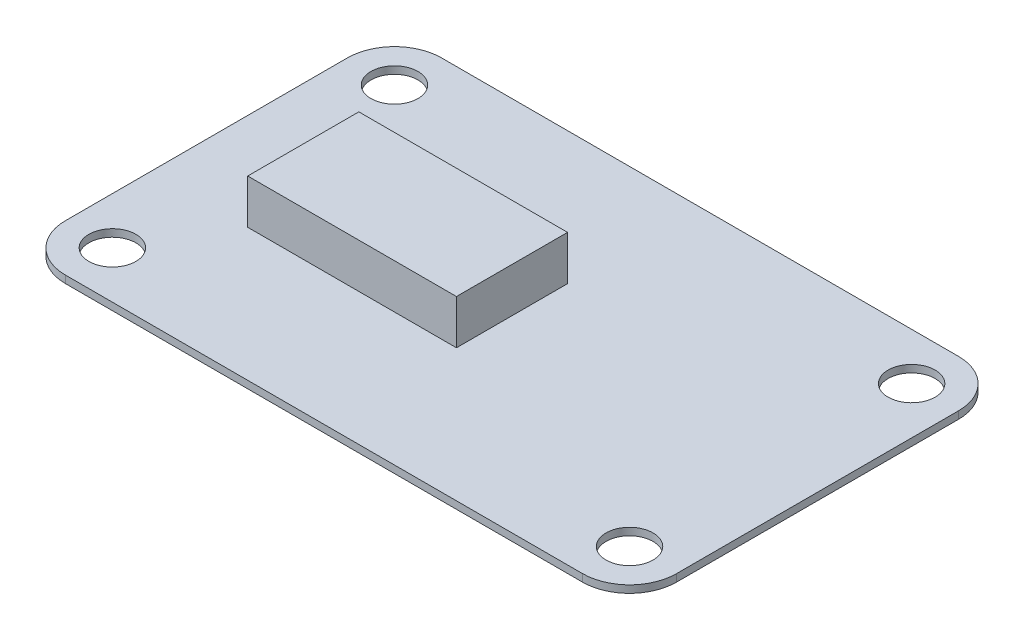
ISO-10303-21;
HEADER;
FILE_DESCRIPTION(('STEP AP214'),'2;1');
FILE_NAME('part.step','',(''),(''),'','','');
FILE_SCHEMA(('AUTOMOTIVE_DESIGN { 1 0 10303 214 1 1 1 1 }'));
ENDSEC;
DATA;
#1=APPLICATION_CONTEXT('core data for automotive mechanical design processes');
#2=APPLICATION_PROTOCOL_DEFINITION('international standard','automotive_design',2000,#1);
#3=PRODUCT_CONTEXT('',#1,'mechanical');
#4=PRODUCT('Part','Part','',(#3));
#5=PRODUCT_RELATED_PRODUCT_CATEGORY('part','',(#4));
#6=PRODUCT_DEFINITION_FORMATION('','',#4);
#7=PRODUCT_DEFINITION_CONTEXT('part definition',#1,'design');
#8=PRODUCT_DEFINITION('design','',#6,#7);
#9=PRODUCT_DEFINITION_SHAPE('','',#8);
#10=(LENGTH_UNIT() NAMED_UNIT(*) SI_UNIT(.MILLI.,.METRE.));
#11=(NAMED_UNIT(*) PLANE_ANGLE_UNIT() SI_UNIT($,.RADIAN.));
#12=(NAMED_UNIT(*) SI_UNIT($,.STERADIAN.) SOLID_ANGLE_UNIT());
#13=UNCERTAINTY_MEASURE_WITH_UNIT(LENGTH_MEASURE(1.E-05),#10,'distance_accuracy_value','');
#14=(GEOMETRIC_REPRESENTATION_CONTEXT(3) GLOBAL_UNCERTAINTY_ASSIGNED_CONTEXT((#13)) GLOBAL_UNIT_ASSIGNED_CONTEXT((#10,
#11,#12)) REPRESENTATION_CONTEXT('',''));
#15=CARTESIAN_POINT('',(0.,0.,0.));
#16=DIRECTION('',(0.,0.,1.));
#17=DIRECTION('',(1.,0.,0.));
#18=AXIS2_PLACEMENT_3D('',#15,#16,#17);
#19=CARTESIAN_POINT('',(-13.97,0.4,7.61999999999999));
#20=DIRECTION('',(0.,-1.,0.));
#21=DIRECTION('',(0.,0.,-1.));
#22=AXIS2_PLACEMENT_3D('',#19,#20,#21);
#23=PLANE('',#22);
#24=CARTESIAN_POINT('',(-13.97,0.4,7.62));
#25=DIRECTION('',(0.,1.,0.));
#26=DIRECTION('',(0.,0.,1.));
#27=AXIS2_PLACEMENT_3D('',#24,#25,#26);
#28=CIRCLE('',#27,1.27);
#29=CARTESIAN_POINT('',(-13.97,0.4,8.89));
#30=VERTEX_POINT('',#29);
#31=EDGE_CURVE('E146',#30,#30,#28,.T.);
#32=ORIENTED_EDGE('',*,*,#31,.F.);
#33=EDGE_LOOP('',(#32));
#34=FACE_BOUND('',#33,.T.);
#35=CARTESIAN_POINT('',(13.97,0.4,-7.62));
#36=DIRECTION('',(0.,1.,0.));
#37=DIRECTION('',(0.,0.,1.));
#38=AXIS2_PLACEMENT_3D('',#35,#36,#37);
#39=CIRCLE('',#38,1.27);
#40=CARTESIAN_POINT('',(13.97,0.4,-6.35));
#41=VERTEX_POINT('',#40);
#42=EDGE_CURVE('E161',#41,#41,#39,.T.);
#43=ORIENTED_EDGE('',*,*,#42,.F.);
#44=EDGE_LOOP('',(#43));
#45=FACE_BOUND('',#44,.T.);
#46=CARTESIAN_POINT('',(-13.97,0.4,7.61999999999999));
#47=DIRECTION('',(0.,1.,0.));
#48=DIRECTION('',(0.,0.,-1.));
#49=AXIS2_PLACEMENT_3D('',#46,#47,#48);
#50=CIRCLE('',#49,2.54000000000001);
#51=CARTESIAN_POINT('',(-16.51,0.4,7.61999999999999));
#52=VERTEX_POINT('',#51);
#53=CARTESIAN_POINT('',(-13.97,0.4,10.16));
#54=VERTEX_POINT('',#53);
#55=EDGE_CURVE('E173',#52,#54,#50,.T.);
#56=ORIENTED_EDGE('',*,*,#55,.T.);
#57=DIRECTION('',(1.,0.,0.));
#58=VECTOR('',#57,1.);
#59=CARTESIAN_POINT('',(13.97,0.4,10.16));
#60=LINE('',#59,#58);
#61=CARTESIAN_POINT('',(13.97,0.4,10.16));
#62=VERTEX_POINT('',#61);
#63=EDGE_CURVE('E176',#54,#62,#60,.T.);
#64=ORIENTED_EDGE('',*,*,#63,.T.);
#65=CARTESIAN_POINT('',(13.97,0.4,7.61999999999999));
#66=DIRECTION('',(0.,1.,0.));
#67=DIRECTION('',(0.,0.,1.));
#68=AXIS2_PLACEMENT_3D('',#65,#66,#67);
#69=CIRCLE('',#68,2.54000000000001);
#70=CARTESIAN_POINT('',(16.51,0.4,7.61999999999999));
#71=VERTEX_POINT('',#70);
#72=EDGE_CURVE('E179',#62,#71,#69,.T.);
#73=ORIENTED_EDGE('',*,*,#72,.T.);
#74=DIRECTION('',(0.,0.,-1.));
#75=VECTOR('',#74,1.);
#76=CARTESIAN_POINT('',(16.51,0.4,7.61999999999999));
#77=LINE('',#76,#75);
#78=CARTESIAN_POINT('',(16.51,0.4,-7.61999999999999));
#79=VERTEX_POINT('',#78);
#80=EDGE_CURVE('E181',#71,#79,#77,.T.);
#81=ORIENTED_EDGE('',*,*,#80,.T.);
#82=CARTESIAN_POINT('',(13.97,0.4,-7.61999999999999));
#83=DIRECTION('',(0.,1.,0.));
#84=DIRECTION('',(0.,0.,1.));
#85=AXIS2_PLACEMENT_3D('',#82,#83,#84);
#86=CIRCLE('',#85,2.54000000000001);
#87=CARTESIAN_POINT('',(13.97,0.4,-10.16));
#88=VERTEX_POINT('',#87);
#89=EDGE_CURVE('E183',#79,#88,#86,.T.);
#90=ORIENTED_EDGE('',*,*,#89,.T.);
#91=DIRECTION('',(-1.,0.,0.));
#92=VECTOR('',#91,1.);
#93=CARTESIAN_POINT('',(13.97,0.4,-10.16));
#94=LINE('',#93,#92);
#95=CARTESIAN_POINT('',(-13.97,0.4,-10.16));
#96=VERTEX_POINT('',#95);
#97=EDGE_CURVE('E185',#88,#96,#94,.T.);
#98=ORIENTED_EDGE('',*,*,#97,.T.);
#99=CARTESIAN_POINT('',(-13.97,0.4,-7.61999999999999));
#100=DIRECTION('',(0.,1.,0.));
#101=DIRECTION('',(0.,0.,1.));
#102=AXIS2_PLACEMENT_3D('',#99,#100,#101);
#103=CIRCLE('',#102,2.54000000000001);
#104=CARTESIAN_POINT('',(-16.51,0.4,-7.61999999999999));
#105=VERTEX_POINT('',#104);
#106=EDGE_CURVE('E187',#96,#105,#103,.T.);
#107=ORIENTED_EDGE('',*,*,#106,.T.);
#108=DIRECTION('',(0.,0.,1.));
#109=VECTOR('',#108,1.);
#110=CARTESIAN_POINT('',(-16.51,0.4,7.61999999999999));
#111=LINE('',#110,#109);
#112=EDGE_CURVE('E189',#105,#52,#111,.T.);
#113=ORIENTED_EDGE('',*,*,#112,.T.);
#114=EDGE_LOOP('',(#56,#64,#73,#81,#90,#98,#107,#113));
#115=FACE_BOUND('',#114,.T.);
#116=CARTESIAN_POINT('',(-13.97,0.4,-7.62));
#117=DIRECTION('',(0.,1.,0.));
#118=DIRECTION('',(0.,0.,1.));
#119=AXIS2_PLACEMENT_3D('',#116,#117,#118);
#120=CIRCLE('',#119,1.27);
#121=CARTESIAN_POINT('',(-13.97,0.4,-6.35));
#122=VERTEX_POINT('',#121);
#123=EDGE_CURVE('E167',#122,#122,#120,.T.);
#124=ORIENTED_EDGE('',*,*,#123,.F.);
#125=EDGE_LOOP('',(#124));
#126=FACE_BOUND('',#125,.T.);
#127=CARTESIAN_POINT('',(13.97,0.4,7.62));
#128=DIRECTION('',(0.,1.,0.));
#129=DIRECTION('',(0.,0.,1.));
#130=AXIS2_PLACEMENT_3D('',#127,#128,#129);
#131=CIRCLE('',#130,1.27);
#132=CARTESIAN_POINT('',(13.97,0.4,8.89));
#133=VERTEX_POINT('',#132);
#134=EDGE_CURVE('E155',#133,#133,#131,.T.);
#135=ORIENTED_EDGE('',*,*,#134,.F.);
#136=EDGE_LOOP('',(#135));
#137=FACE_BOUND('',#136,.T.);
#138=DIRECTION('',(0.,0.,-1.));
#139=VECTOR('',#138,1.);
#140=CARTESIAN_POINT('',(0.,0.4,-3.00130818892287));
#141=LINE('',#140,#139);
#142=CARTESIAN_POINT('',(0.,0.4,3.00130818892287));
#143=VERTEX_POINT('',#142);
#144=CARTESIAN_POINT('',(0.,0.4,-3.00130818892287));
#145=VERTEX_POINT('',#144);
#146=EDGE_CURVE('E142',#143,#145,#141,.T.);
#147=ORIENTED_EDGE('',*,*,#146,.F.);
#148=DIRECTION('',(1.,0.,0.));
#149=VECTOR('',#148,1.);
#150=CARTESIAN_POINT('',(-11.2759429153925,0.4,3.00130818892287));
#151=LINE('',#150,#149);
#152=CARTESIAN_POINT('',(-11.2759429153925,0.4,3.00130818892287));
#153=VERTEX_POINT('',#152);
#154=EDGE_CURVE('E139',#153,#143,#151,.T.);
#155=ORIENTED_EDGE('',*,*,#154,.F.);
#156=DIRECTION('',(0.,0.,1.));
#157=VECTOR('',#156,1.);
#158=CARTESIAN_POINT('',(-11.2759429153925,0.4,-3.00130818892287));
#159=LINE('',#158,#157);
#160=CARTESIAN_POINT('',(-11.2759429153925,0.4,-3.00130818892287));
#161=VERTEX_POINT('',#160);
#162=EDGE_CURVE('E53',#161,#153,#159,.T.);
#163=ORIENTED_EDGE('',*,*,#162,.F.);
#164=DIRECTION('',(-1.,0.,0.));
#165=VECTOR('',#164,1.);
#166=CARTESIAN_POINT('',(-11.2759429153925,0.4,-3.00130818892287));
#167=LINE('',#166,#165);
#168=EDGE_CURVE('E48',#145,#161,#167,.T.);
#169=ORIENTED_EDGE('',*,*,#168,.F.);
#170=EDGE_LOOP('',(#147,#155,#163,#169));
#171=FACE_BOUND('',#170,.T.);
#172=ADVANCED_FACE('F33',(#34,#45,#115,#126,#137,#171),#23,.F.);
#173=CARTESIAN_POINT('',(-13.97,0.,7.61999999999999));
#174=DIRECTION('',(0.,-1.,0.));
#175=DIRECTION('',(0.,0.,-1.));
#176=AXIS2_PLACEMENT_3D('',#173,#174,#175);
#177=PLANE('',#176);
#178=CARTESIAN_POINT('',(13.97,0.,7.62));
#179=DIRECTION('',(0.,1.,0.));
#180=DIRECTION('',(0.,0.,1.));
#181=AXIS2_PLACEMENT_3D('',#178,#179,#180);
#182=CIRCLE('',#181,1.27);
#183=CARTESIAN_POINT('',(13.97,0.,8.89));
#184=VERTEX_POINT('',#183);
#185=EDGE_CURVE('E153',#184,#184,#182,.T.);
#186=ORIENTED_EDGE('',*,*,#185,.T.);
#187=EDGE_LOOP('',(#186));
#188=FACE_BOUND('',#187,.T.);
#189=CARTESIAN_POINT('',(-13.97,0.,-7.62));
#190=DIRECTION('',(0.,1.,0.));
#191=DIRECTION('',(0.,0.,1.));
#192=AXIS2_PLACEMENT_3D('',#189,#190,#191);
#193=CIRCLE('',#192,1.27);
#194=CARTESIAN_POINT('',(-13.97,0.,-6.35));
#195=VERTEX_POINT('',#194);
#196=EDGE_CURVE('E164',#195,#195,#193,.T.);
#197=ORIENTED_EDGE('',*,*,#196,.T.);
#198=EDGE_LOOP('',(#197));
#199=FACE_BOUND('',#198,.T.);
#200=CARTESIAN_POINT('',(-13.97,0.,7.61999999999999));
#201=DIRECTION('',(0.,1.,0.));
#202=DIRECTION('',(0.,0.,-1.));
#203=AXIS2_PLACEMENT_3D('',#200,#201,#202);
#204=CIRCLE('',#203,2.54000000000001);
#205=CARTESIAN_POINT('',(-16.51,0.,7.61999999999999));
#206=VERTEX_POINT('',#205);
#207=CARTESIAN_POINT('',(-13.97,0.,10.16));
#208=VERTEX_POINT('',#207);
#209=EDGE_CURVE('E170',#206,#208,#204,.T.);
#210=ORIENTED_EDGE('',*,*,#209,.F.);
#211=DIRECTION('',(0.,0.,1.));
#212=VECTOR('',#211,1.);
#213=CARTESIAN_POINT('',(-16.51,0.,7.61999999999999));
#214=LINE('',#213,#212);
#215=CARTESIAN_POINT('',(-16.51,0.,-7.61999999999999));
#216=VERTEX_POINT('',#215);
#217=EDGE_CURVE('E177',#216,#206,#214,.T.);
#218=ORIENTED_EDGE('',*,*,#217,.F.);
#219=CARTESIAN_POINT('',(-13.97,0.,-7.61999999999999));
#220=DIRECTION('',(0.,1.,0.));
#221=DIRECTION('',(0.,0.,1.));
#222=AXIS2_PLACEMENT_3D('',#219,#220,#221);
#223=CIRCLE('',#222,2.54000000000001);
#224=CARTESIAN_POINT('',(-13.97,0.,-10.16));
#225=VERTEX_POINT('',#224);
#226=EDGE_CURVE('E204',#225,#216,#223,.T.);
#227=ORIENTED_EDGE('',*,*,#226,.F.);
#228=DIRECTION('',(-1.,0.,0.));
#229=VECTOR('',#228,1.);
#230=CARTESIAN_POINT('',(13.97,0.,-10.16));
#231=LINE('',#230,#229);
#232=CARTESIAN_POINT('',(13.97,0.,-10.16));
#233=VERTEX_POINT('',#232);
#234=EDGE_CURVE('E202',#233,#225,#231,.T.);
#235=ORIENTED_EDGE('',*,*,#234,.F.);
#236=CARTESIAN_POINT('',(13.97,0.,-7.61999999999999));
#237=DIRECTION('',(0.,1.,0.));
#238=DIRECTION('',(0.,0.,1.));
#239=AXIS2_PLACEMENT_3D('',#236,#237,#238);
#240=CIRCLE('',#239,2.54000000000001);
#241=CARTESIAN_POINT('',(16.51,0.,-7.61999999999999));
#242=VERTEX_POINT('',#241);
#243=EDGE_CURVE('E200',#242,#233,#240,.T.);
#244=ORIENTED_EDGE('',*,*,#243,.F.);
#245=DIRECTION('',(0.,0.,-1.));
#246=VECTOR('',#245,1.);
#247=CARTESIAN_POINT('',(16.51,0.,7.61999999999999));
#248=LINE('',#247,#246);
#249=CARTESIAN_POINT('',(16.51,0.,7.61999999999999));
#250=VERTEX_POINT('',#249);
#251=EDGE_CURVE('E198',#250,#242,#248,.T.);
#252=ORIENTED_EDGE('',*,*,#251,.F.);
#253=CARTESIAN_POINT('',(13.97,0.,7.61999999999999));
#254=DIRECTION('',(0.,1.,0.));
#255=DIRECTION('',(0.,0.,1.));
#256=AXIS2_PLACEMENT_3D('',#253,#254,#255);
#257=CIRCLE('',#256,2.54000000000001);
#258=CARTESIAN_POINT('',(13.97,0.,10.16));
#259=VERTEX_POINT('',#258);
#260=EDGE_CURVE('E196',#259,#250,#257,.T.);
#261=ORIENTED_EDGE('',*,*,#260,.F.);
#262=DIRECTION('',(1.,0.,0.));
#263=VECTOR('',#262,1.);
#264=CARTESIAN_POINT('',(13.97,0.,10.16));
#265=LINE('',#264,#263);
#266=EDGE_CURVE('E194',#208,#259,#265,.T.);
#267=ORIENTED_EDGE('',*,*,#266,.F.);
#268=EDGE_LOOP('',(#210,#218,#227,#235,#244,#252,#261,#267));
#269=FACE_BOUND('',#268,.T.);
#270=CARTESIAN_POINT('',(13.97,0.,-7.62));
#271=DIRECTION('',(0.,1.,0.));
#272=DIRECTION('',(0.,0.,1.));
#273=AXIS2_PLACEMENT_3D('',#270,#271,#272);
#274=CIRCLE('',#273,1.27);
#275=CARTESIAN_POINT('',(13.97,0.,-6.35));
#276=VERTEX_POINT('',#275);
#277=EDGE_CURVE('E158',#276,#276,#274,.T.);
#278=ORIENTED_EDGE('',*,*,#277,.T.);
#279=EDGE_LOOP('',(#278));
#280=FACE_BOUND('',#279,.T.);
#281=CARTESIAN_POINT('',(-13.97,0.,7.62));
#282=DIRECTION('',(0.,1.,0.));
#283=DIRECTION('',(0.,0.,1.));
#284=AXIS2_PLACEMENT_3D('',#281,#282,#283);
#285=CIRCLE('',#284,1.27);
#286=CARTESIAN_POINT('',(-13.97,0.,8.89));
#287=VERTEX_POINT('',#286);
#288=EDGE_CURVE('E143',#287,#287,#285,.T.);
#289=ORIENTED_EDGE('',*,*,#288,.T.);
#290=EDGE_LOOP('',(#289));
#291=FACE_BOUND('',#290,.T.);
#292=ADVANCED_FACE('F234',(#188,#199,#269,#280,#291),#177,.T.);
#293=CARTESIAN_POINT('',(-13.97,0.4,7.61999999999999));
#294=DIRECTION('',(0.,-1.,0.));
#295=DIRECTION('',(0.,0.,-1.));
#296=AXIS2_PLACEMENT_3D('',#293,#294,#295);
#297=CYLINDRICAL_SURFACE('',#296,2.54000000000001);
#298=ORIENTED_EDGE('',*,*,#209,.T.);
#299=DIRECTION('',(0.,-1.,0.));
#300=VECTOR('',#299,1.);
#301=CARTESIAN_POINT('',(-13.97,0.4,10.16));
#302=LINE('',#301,#300);
#303=EDGE_CURVE('E11',#54,#208,#302,.T.);
#304=ORIENTED_EDGE('',*,*,#303,.F.);
#305=ORIENTED_EDGE('',*,*,#55,.F.);
#306=DIRECTION('',(0.,-1.,0.));
#307=VECTOR('',#306,1.);
#308=CARTESIAN_POINT('',(-16.51,0.4,7.61999999999999));
#309=LINE('',#308,#307);
#310=EDGE_CURVE('E191',#52,#206,#309,.T.);
#311=ORIENTED_EDGE('',*,*,#310,.T.);
#312=EDGE_LOOP('',(#298,#304,#305,#311));
#313=FACE_BOUND('',#312,.T.);
#314=ADVANCED_FACE('F35',(#313),#297,.T.);
#315=CARTESIAN_POINT('',(13.97,0.4,10.16));
#316=DIRECTION('',(0.,0.,-1.));
#317=DIRECTION('',(-1.,0.,0.));
#318=AXIS2_PLACEMENT_3D('',#315,#316,#317);
#319=PLANE('',#318);
#320=ORIENTED_EDGE('',*,*,#266,.T.);
#321=DIRECTION('',(0.,-1.,0.));
#322=VECTOR('',#321,1.);
#323=CARTESIAN_POINT('',(13.97,0.4,10.16));
#324=LINE('',#323,#322);
#325=EDGE_CURVE('E41',#62,#259,#324,.T.);
#326=ORIENTED_EDGE('',*,*,#325,.F.);
#327=ORIENTED_EDGE('',*,*,#63,.F.);
#328=ORIENTED_EDGE('',*,*,#303,.T.);
#329=EDGE_LOOP('',(#320,#326,#327,#328));
#330=FACE_BOUND('',#329,.T.);
#331=ADVANCED_FACE('F252',(#330),#319,.F.);
#332=CARTESIAN_POINT('',(13.97,0.4,7.61999999999999));
#333=DIRECTION('',(0.,-1.,0.));
#334=DIRECTION('',(0.,0.,-1.));
#335=AXIS2_PLACEMENT_3D('',#332,#333,#334);
#336=CYLINDRICAL_SURFACE('',#335,2.54000000000001);
#337=ORIENTED_EDGE('',*,*,#260,.T.);
#338=DIRECTION('',(0.,-1.,0.));
#339=VECTOR('',#338,1.);
#340=CARTESIAN_POINT('',(16.51,0.4,7.61999999999999));
#341=LINE('',#340,#339);
#342=EDGE_CURVE('E221',#71,#250,#341,.T.);
#343=ORIENTED_EDGE('',*,*,#342,.F.);
#344=ORIENTED_EDGE('',*,*,#72,.F.);
#345=ORIENTED_EDGE('',*,*,#325,.T.);
#346=EDGE_LOOP('',(#337,#343,#344,#345));
#347=FACE_BOUND('',#346,.T.);
#348=ADVANCED_FACE('F228',(#347),#336,.T.);
#349=CARTESIAN_POINT('',(16.51,0.4,7.61999999999999));
#350=DIRECTION('',(-1.,0.,0.));
#351=DIRECTION('',(0.,0.,1.));
#352=AXIS2_PLACEMENT_3D('',#349,#350,#351);
#353=PLANE('',#352);
#354=ORIENTED_EDGE('',*,*,#251,.T.);
#355=DIRECTION('',(0.,-1.,0.));
#356=VECTOR('',#355,1.);
#357=CARTESIAN_POINT('',(16.51,0.4,-7.61999999999999));
#358=LINE('',#357,#356);
#359=EDGE_CURVE('E218',#79,#242,#358,.T.);
#360=ORIENTED_EDGE('',*,*,#359,.F.);
#361=ORIENTED_EDGE('',*,*,#80,.F.);
#362=ORIENTED_EDGE('',*,*,#342,.T.);
#363=EDGE_LOOP('',(#354,#360,#361,#362));
#364=FACE_BOUND('',#363,.T.);
#365=ADVANCED_FACE('F240',(#364),#353,.F.);
#366=CARTESIAN_POINT('',(13.97,0.4,-7.61999999999999));
#367=DIRECTION('',(0.,-1.,0.));
#368=DIRECTION('',(0.,0.,-1.));
#369=AXIS2_PLACEMENT_3D('',#366,#367,#368);
#370=CYLINDRICAL_SURFACE('',#369,2.54000000000001);
#371=ORIENTED_EDGE('',*,*,#243,.T.);
#372=DIRECTION('',(0.,-1.,0.));
#373=VECTOR('',#372,1.);
#374=CARTESIAN_POINT('',(13.97,0.4,-10.16));
#375=LINE('',#374,#373);
#376=EDGE_CURVE('E215',#88,#233,#375,.T.);
#377=ORIENTED_EDGE('',*,*,#376,.F.);
#378=ORIENTED_EDGE('',*,*,#89,.F.);
#379=ORIENTED_EDGE('',*,*,#359,.T.);
#380=EDGE_LOOP('',(#371,#377,#378,#379));
#381=FACE_BOUND('',#380,.T.);
#382=ADVANCED_FACE('F244',(#381),#370,.T.);
#383=CARTESIAN_POINT('',(13.97,0.4,-10.16));
#384=DIRECTION('',(0.,0.,1.));
#385=DIRECTION('',(1.,0.,0.));
#386=AXIS2_PLACEMENT_3D('',#383,#384,#385);
#387=PLANE('',#386);
#388=ORIENTED_EDGE('',*,*,#234,.T.);
#389=DIRECTION('',(0.,-1.,0.));
#390=VECTOR('',#389,1.);
#391=CARTESIAN_POINT('',(-13.97,0.4,-10.16));
#392=LINE('',#391,#390);
#393=EDGE_CURVE('E212',#96,#225,#392,.T.);
#394=ORIENTED_EDGE('',*,*,#393,.F.);
#395=ORIENTED_EDGE('',*,*,#97,.F.);
#396=ORIENTED_EDGE('',*,*,#376,.T.);
#397=EDGE_LOOP('',(#388,#394,#395,#396));
#398=FACE_BOUND('',#397,.T.);
#399=ADVANCED_FACE('F265',(#398),#387,.F.);
#400=CARTESIAN_POINT('',(-13.97,0.4,-7.61999999999999));
#401=DIRECTION('',(0.,-1.,0.));
#402=DIRECTION('',(0.,0.,-1.));
#403=AXIS2_PLACEMENT_3D('',#400,#401,#402);
#404=CYLINDRICAL_SURFACE('',#403,2.54000000000001);
#405=ORIENTED_EDGE('',*,*,#226,.T.);
#406=DIRECTION('',(0.,-1.,0.));
#407=VECTOR('',#406,1.);
#408=CARTESIAN_POINT('',(-16.51,0.4,-7.61999999999999));
#409=LINE('',#408,#407);
#410=EDGE_CURVE('E209',#105,#216,#409,.T.);
#411=ORIENTED_EDGE('',*,*,#410,.F.);
#412=ORIENTED_EDGE('',*,*,#106,.F.);
#413=ORIENTED_EDGE('',*,*,#393,.T.);
#414=EDGE_LOOP('',(#405,#411,#412,#413));
#415=FACE_BOUND('',#414,.T.);
#416=ADVANCED_FACE('F263',(#415),#404,.T.);
#417=CARTESIAN_POINT('',(-16.51,0.4,7.61999999999999));
#418=DIRECTION('',(1.,0.,0.));
#419=DIRECTION('',(0.,0.,-1.));
#420=AXIS2_PLACEMENT_3D('',#417,#418,#419);
#421=PLANE('',#420);
#422=ORIENTED_EDGE('',*,*,#217,.T.);
#423=ORIENTED_EDGE('',*,*,#310,.F.);
#424=ORIENTED_EDGE('',*,*,#112,.F.);
#425=ORIENTED_EDGE('',*,*,#410,.T.);
#426=EDGE_LOOP('',(#422,#423,#424,#425));
#427=FACE_BOUND('',#426,.T.);
#428=ADVANCED_FACE('F258',(#427),#421,.F.);
#429=CARTESIAN_POINT('',(-13.97,0.4,-7.62));
#430=DIRECTION('',(0.,-1.,0.));
#431=DIRECTION('',(0.,0.,-1.));
#432=AXIS2_PLACEMENT_3D('',#429,#430,#431);
#433=CYLINDRICAL_SURFACE('',#432,1.27);
#434=ORIENTED_EDGE('',*,*,#123,.T.);
#435=EDGE_LOOP('',(#434));
#436=FACE_BOUND('',#435,.T.);
#437=ORIENTED_EDGE('',*,*,#196,.F.);
#438=EDGE_LOOP('',(#437));
#439=FACE_BOUND('',#438,.T.);
#440=ADVANCED_FACE('F285',(#436,#439),#433,.F.);
#441=CARTESIAN_POINT('',(13.97,0.4,-7.62));
#442=DIRECTION('',(0.,-1.,0.));
#443=DIRECTION('',(0.,0.,-1.));
#444=AXIS2_PLACEMENT_3D('',#441,#442,#443);
#445=CYLINDRICAL_SURFACE('',#444,1.27);
#446=ORIENTED_EDGE('',*,*,#42,.T.);
#447=EDGE_LOOP('',(#446));
#448=FACE_BOUND('',#447,.T.);
#449=ORIENTED_EDGE('',*,*,#277,.F.);
#450=EDGE_LOOP('',(#449));
#451=FACE_BOUND('',#450,.T.);
#452=ADVANCED_FACE('F292',(#448,#451),#445,.F.);
#453=CARTESIAN_POINT('',(13.97,0.4,7.62));
#454=DIRECTION('',(0.,-1.,0.));
#455=DIRECTION('',(0.,0.,-1.));
#456=AXIS2_PLACEMENT_3D('',#453,#454,#455);
#457=CYLINDRICAL_SURFACE('',#456,1.27);
#458=ORIENTED_EDGE('',*,*,#134,.T.);
#459=EDGE_LOOP('',(#458));
#460=FACE_BOUND('',#459,.T.);
#461=ORIENTED_EDGE('',*,*,#185,.F.);
#462=EDGE_LOOP('',(#461));
#463=FACE_BOUND('',#462,.T.);
#464=ADVANCED_FACE('F297',(#460,#463),#457,.F.);
#465=CARTESIAN_POINT('',(-13.97,0.4,7.62));
#466=DIRECTION('',(0.,-1.,0.));
#467=DIRECTION('',(0.,0.,-1.));
#468=AXIS2_PLACEMENT_3D('',#465,#466,#467);
#469=CYLINDRICAL_SURFACE('',#468,1.27);
#470=ORIENTED_EDGE('',*,*,#31,.T.);
#471=EDGE_LOOP('',(#470));
#472=FACE_BOUND('',#471,.T.);
#473=ORIENTED_EDGE('',*,*,#288,.F.);
#474=EDGE_LOOP('',(#473));
#475=FACE_BOUND('',#474,.T.);
#476=ADVANCED_FACE('F332',(#472,#475),#469,.F.);
#477=CARTESIAN_POINT('',(0.,2.8,-3.00130818892287));
#478=DIRECTION('',(-1.,0.,0.));
#479=DIRECTION('',(0.,0.,1.));
#480=AXIS2_PLACEMENT_3D('',#477,#478,#479);
#481=PLANE('',#480);
#482=ORIENTED_EDGE('',*,*,#146,.T.);
#483=DIRECTION('',(0.,-1.,0.));
#484=VECTOR('',#483,1.);
#485=CARTESIAN_POINT('',(0.,2.8,-3.00130818892287));
#486=LINE('',#485,#484);
#487=CARTESIAN_POINT('',(0.,2.8,-3.00130818892287));
#488=VERTEX_POINT('',#487);
#489=EDGE_CURVE('E123',#488,#145,#486,.T.);
#490=ORIENTED_EDGE('',*,*,#489,.F.);
#491=DIRECTION('',(0.,0.,-1.));
#492=VECTOR('',#491,1.);
#493=CARTESIAN_POINT('',(0.,2.8,-3.00130818892287));
#494=LINE('',#493,#492);
#495=CARTESIAN_POINT('',(0.,2.8,3.00130818892287));
#496=VERTEX_POINT('',#495);
#497=EDGE_CURVE('E130',#496,#488,#494,.T.);
#498=ORIENTED_EDGE('',*,*,#497,.F.);
#499=DIRECTION('',(0.,-1.,0.));
#500=VECTOR('',#499,1.);
#501=CARTESIAN_POINT('',(0.,2.8,3.00130818892287));
#502=LINE('',#501,#500);
#503=EDGE_CURVE('E310',#496,#143,#502,.T.);
#504=ORIENTED_EDGE('',*,*,#503,.T.);
#505=EDGE_LOOP('',(#482,#490,#498,#504));
#506=FACE_BOUND('',#505,.T.);
#507=ADVANCED_FACE('F141',(#506),#481,.F.);
#508=CARTESIAN_POINT('',(-11.2759429153925,2.8,-3.00130818892287));
#509=DIRECTION('',(0.,0.,1.));
#510=DIRECTION('',(1.,0.,0.));
#511=AXIS2_PLACEMENT_3D('',#508,#509,#510);
#512=PLANE('',#511);
#513=ORIENTED_EDGE('',*,*,#168,.T.);
#514=DIRECTION('',(0.,-1.,0.));
#515=VECTOR('',#514,1.);
#516=CARTESIAN_POINT('',(-11.2759429153925,2.8,-3.00130818892287));
#517=LINE('',#516,#515);
#518=CARTESIAN_POINT('',(-11.2759429153925,2.8,-3.00130818892287));
#519=VERTEX_POINT('',#518);
#520=EDGE_CURVE('E126',#519,#161,#517,.T.);
#521=ORIENTED_EDGE('',*,*,#520,.F.);
#522=DIRECTION('',(-1.,0.,0.));
#523=VECTOR('',#522,1.);
#524=CARTESIAN_POINT('',(-11.2759429153925,2.8,-3.00130818892287));
#525=LINE('',#524,#523);
#526=EDGE_CURVE('E119',#488,#519,#525,.T.);
#527=ORIENTED_EDGE('',*,*,#526,.F.);
#528=ORIENTED_EDGE('',*,*,#489,.T.);
#529=EDGE_LOOP('',(#513,#521,#527,#528));
#530=FACE_BOUND('',#529,.T.);
#531=ADVANCED_FACE('F121',(#530),#512,.F.);
#532=CARTESIAN_POINT('',(-11.2759429153925,2.8,-3.00130818892287));
#533=DIRECTION('',(1.,0.,0.));
#534=DIRECTION('',(0.,0.,-1.));
#535=AXIS2_PLACEMENT_3D('',#532,#533,#534);
#536=PLANE('',#535);
#537=ORIENTED_EDGE('',*,*,#162,.T.);
#538=DIRECTION('',(0.,-1.,0.));
#539=VECTOR('',#538,1.);
#540=CARTESIAN_POINT('',(-11.2759429153925,2.8,3.00130818892287));
#541=LINE('',#540,#539);
#542=CARTESIAN_POINT('',(-11.2759429153925,2.8,3.00130818892287));
#543=VERTEX_POINT('',#542);
#544=EDGE_CURVE('E148',#543,#153,#541,.T.);
#545=ORIENTED_EDGE('',*,*,#544,.F.);
#546=DIRECTION('',(0.,0.,1.));
#547=VECTOR('',#546,1.);
#548=CARTESIAN_POINT('',(-11.2759429153925,2.8,-3.00130818892287));
#549=LINE('',#548,#547);
#550=EDGE_CURVE('E129',#519,#543,#549,.T.);
#551=ORIENTED_EDGE('',*,*,#550,.F.);
#552=ORIENTED_EDGE('',*,*,#520,.T.);
#553=EDGE_LOOP('',(#537,#545,#551,#552));
#554=FACE_BOUND('',#553,.T.);
#555=ADVANCED_FACE('F319',(#554),#536,.F.);
#556=CARTESIAN_POINT('',(-11.2759429153925,2.8,3.00130818892287));
#557=DIRECTION('',(0.,0.,-1.));
#558=DIRECTION('',(-1.,0.,0.));
#559=AXIS2_PLACEMENT_3D('',#556,#557,#558);
#560=PLANE('',#559);
#561=ORIENTED_EDGE('',*,*,#154,.T.);
#562=ORIENTED_EDGE('',*,*,#503,.F.);
#563=DIRECTION('',(1.,0.,0.));
#564=VECTOR('',#563,1.);
#565=CARTESIAN_POINT('',(-11.2759429153925,2.8,3.00130818892287));
#566=LINE('',#565,#564);
#567=EDGE_CURVE('E135',#543,#496,#566,.T.);
#568=ORIENTED_EDGE('',*,*,#567,.F.);
#569=ORIENTED_EDGE('',*,*,#544,.T.);
#570=EDGE_LOOP('',(#561,#562,#568,#569));
#571=FACE_BOUND('',#570,.T.);
#572=ADVANCED_FACE('F309',(#571),#560,.F.);
#573=CARTESIAN_POINT('',(0.,2.8,0.));
#574=DIRECTION('',(0.,1.,0.));
#575=DIRECTION('',(0.,0.,1.));
#576=AXIS2_PLACEMENT_3D('',#573,#574,#575);
#577=PLANE('',#576);
#578=ORIENTED_EDGE('',*,*,#497,.T.);
#579=ORIENTED_EDGE('',*,*,#526,.T.);
#580=ORIENTED_EDGE('',*,*,#550,.T.);
#581=ORIENTED_EDGE('',*,*,#567,.T.);
#582=EDGE_LOOP('',(#578,#579,#580,#581));
#583=FACE_BOUND('',#582,.T.);
#584=ADVANCED_FACE('F133',(#583),#577,.T.);
#585=CLOSED_SHELL('',(#172,#292,#314,#331,#348,#365,#382,#399,#416,#428,#440,#452,#464,#476,
#507,#531,#555,#572,#584));
#586=MANIFOLD_SOLID_BREP('B2',#585);
#587=ADVANCED_BREP_SHAPE_REPRESENTATION('',(#18,#586),#14);
#588=SHAPE_DEFINITION_REPRESENTATION(#9,#587);
ENDSEC;
END-ISO-10303-21;
